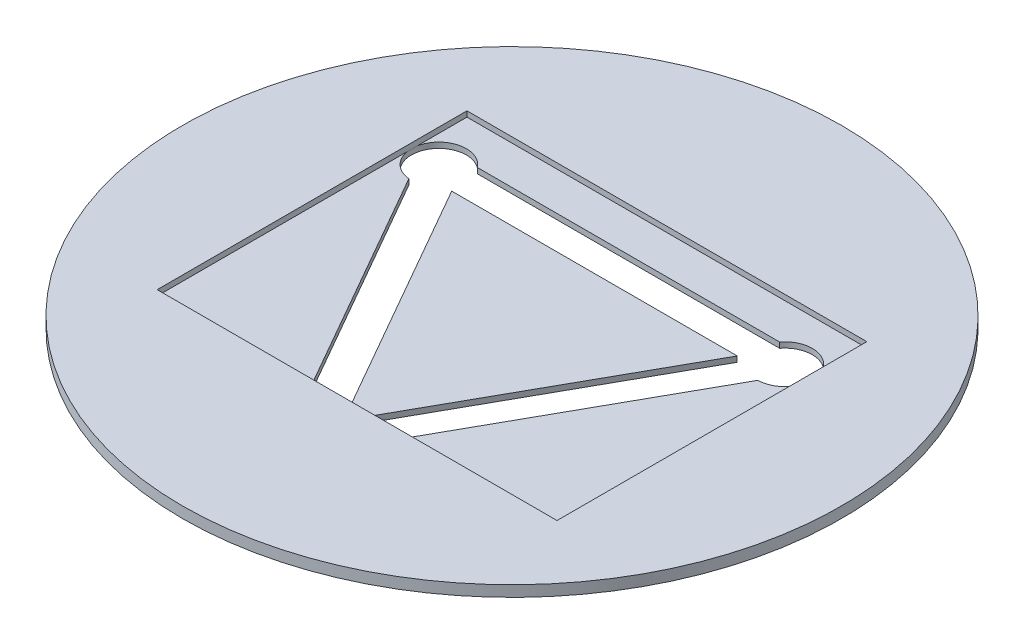
ISO-10303-21;
HEADER;
FILE_DESCRIPTION(('STEP AP214'),'2;1');
FILE_NAME('part.step','',(''),(''),'','','');
FILE_SCHEMA(('AUTOMOTIVE_DESIGN { 1 0 10303 214 1 1 1 1 }'));
ENDSEC;
DATA;
#1=APPLICATION_CONTEXT('core data for automotive mechanical design processes');
#2=APPLICATION_PROTOCOL_DEFINITION('international standard','automotive_design',2000,#1);
#3=PRODUCT_CONTEXT('',#1,'mechanical');
#4=PRODUCT('Part','Part','',(#3));
#5=PRODUCT_RELATED_PRODUCT_CATEGORY('part','',(#4));
#6=PRODUCT_DEFINITION_FORMATION('','',#4);
#7=PRODUCT_DEFINITION_CONTEXT('part definition',#1,'design');
#8=PRODUCT_DEFINITION('design','',#6,#7);
#9=PRODUCT_DEFINITION_SHAPE('','',#8);
#10=(LENGTH_UNIT() NAMED_UNIT(*) SI_UNIT(.MILLI.,.METRE.));
#11=(NAMED_UNIT(*) PLANE_ANGLE_UNIT() SI_UNIT($,.RADIAN.));
#12=(NAMED_UNIT(*) SI_UNIT($,.STERADIAN.) SOLID_ANGLE_UNIT());
#13=UNCERTAINTY_MEASURE_WITH_UNIT(LENGTH_MEASURE(1.E-05),#10,'distance_accuracy_value','');
#14=(GEOMETRIC_REPRESENTATION_CONTEXT(3) GLOBAL_UNCERTAINTY_ASSIGNED_CONTEXT((#13)) GLOBAL_UNIT_ASSIGNED_CONTEXT((#10,
#11,#12)) REPRESENTATION_CONTEXT('',''));
#15=CARTESIAN_POINT('',(0.,0.,0.));
#16=DIRECTION('',(0.,0.,1.));
#17=DIRECTION('',(1.,0.,0.));
#18=AXIS2_PLACEMENT_3D('',#15,#16,#17);
#19=CARTESIAN_POINT('',(0.,2.5,0.));
#20=DIRECTION('',(0.,-1.,0.));
#21=DIRECTION('',(0.,0.,-1.));
#22=AXIS2_PLACEMENT_3D('',#19,#20,#21);
#23=PLANE('',#22);
#24=CARTESIAN_POINT('',(78.7279655648643,2.5,-45.453612111618));
#25=DIRECTION('',(0.,-1.,0.));
#26=DIRECTION('',(0.,0.,-1.));
#27=AXIS2_PLACEMENT_3D('',#24,#25,#26);
#28=CIRCLE('',#27,12.5);
#29=CARTESIAN_POINT('',(91.,2.5,-43.0772344432236));
#30=VERTEX_POINT('',#29);
#31=CARTESIAN_POINT('',(78.934736547983,2.5,-32.9553223981996));
#32=VERTEX_POINT('',#31);
#33=EDGE_CURVE('E318',#30,#32,#28,.T.);
#34=ORIENTED_EDGE('',*,*,#33,.T.);
#35=DIRECTION('',(-0.48703970260465,0.,0.873379830364071));
#36=VECTOR('',#35,1.);
#37=CARTESIAN_POINT('',(78.934736547983,2.5,-32.9553223981996));
#38=LINE('',#37,#36);
#39=CARTESIAN_POINT('',(21.2429423229166,2.5,70.5));
#40=VERTEX_POINT('',#39);
#41=EDGE_CURVE('E218',#32,#40,#38,.T.);
#42=ORIENTED_EDGE('',*,*,#41,.T.);
#43=DIRECTION('',(1.,0.,0.));
#44=VECTOR('',#43,1.);
#45=CARTESIAN_POINT('',(-91.,2.5,70.5));
#46=LINE('',#45,#44);
#47=CARTESIAN_POINT('',(91.,2.5,70.5));
#48=VERTEX_POINT('',#47);
#49=EDGE_CURVE('E266',#40,#48,#46,.T.);
#50=ORIENTED_EDGE('',*,*,#49,.T.);
#51=DIRECTION('',(0.,0.,-1.));
#52=VECTOR('',#51,1.);
#53=CARTESIAN_POINT('',(91.,2.5,70.5));
#54=LINE('',#53,#52);
#55=EDGE_CURVE('E251',#48,#30,#54,.T.);
#56=ORIENTED_EDGE('',*,*,#55,.T.);
#57=EDGE_LOOP('',(#34,#42,#50,#56));
#58=FACE_BOUND('',#57,.T.);
#59=ADVANCED_FACE('F44',(#58),#23,.F.);
#60=CARTESIAN_POINT('',(-78.7279655648505,2.5,-45.453612111626));
#61=DIRECTION('',(0.,-1.,0.));
#62=DIRECTION('',(0.,0.,-1.));
#63=AXIS2_PLACEMENT_3D('',#60,#61,#62);
#64=CIRCLE('',#63,12.5);
#65=CARTESIAN_POINT('',(-91.,2.5,-47.8299897799495));
#66=VERTEX_POINT('',#65);
#67=CARTESIAN_POINT('',(-68.7826687848202,2.5,-53.0260008996584));
#68=VERTEX_POINT('',#67);
#69=EDGE_CURVE('E328',#66,#68,#64,.T.);
#70=ORIENTED_EDGE('',*,*,#69,.T.);
#71=DIRECTION('',(1.,0.,0.));
#72=VECTOR('',#71,1.);
#73=CARTESIAN_POINT('',(-68.7826687848202,2.5,-53.0260008996584));
#74=LINE('',#73,#72);
#75=CARTESIAN_POINT('',(68.7826687848401,2.5,-53.0260008996584));
#76=VERTEX_POINT('',#75);
#77=EDGE_CURVE('E212',#68,#76,#74,.T.);
#78=ORIENTED_EDGE('',*,*,#77,.T.);
#79=CARTESIAN_POINT('',(91.,2.5,-47.8299897800125));
#80=VERTEX_POINT('',#79);
#81=EDGE_CURVE('E319',#76,#80,#28,.T.);
#82=ORIENTED_EDGE('',*,*,#81,.T.);
#83=CARTESIAN_POINT('',(91.,2.5,-70.5));
#84=VERTEX_POINT('',#83);
#85=EDGE_CURVE('E257',#80,#84,#54,.T.);
#86=ORIENTED_EDGE('',*,*,#85,.T.);
#87=DIRECTION('',(-1.,0.,0.));
#88=VECTOR('',#87,1.);
#89=CARTESIAN_POINT('',(-91.,2.5,-70.5));
#90=LINE('',#89,#88);
#91=CARTESIAN_POINT('',(-91.,2.5,-70.5));
#92=VERTEX_POINT('',#91);
#93=EDGE_CURVE('E255',#84,#92,#90,.T.);
#94=ORIENTED_EDGE('',*,*,#93,.T.);
#95=DIRECTION('',(0.,0.,1.));
#96=VECTOR('',#95,1.);
#97=CARTESIAN_POINT('',(-91.,2.5,70.5));
#98=LINE('',#97,#96);
#99=EDGE_CURVE('E262',#92,#66,#98,.T.);
#100=ORIENTED_EDGE('',*,*,#99,.T.);
#101=EDGE_LOOP('',(#70,#78,#82,#86,#94,#100));
#102=FACE_BOUND('',#101,.T.);
#103=ADVANCED_FACE('F358',(#102),#23,.F.);
#104=DIRECTION('',(-0.496464150850641,0.,-0.868057225602179));
#105=VECTOR('',#104,1.);
#106=CARTESIAN_POINT('',(-32.8913255647166,2.5,18.8113911562814));
#107=LINE('',#106,#105);
#108=CARTESIAN_POINT('',(-3.3292868633556,2.5,70.5));
#109=VERTEX_POINT('',#108);
#110=CARTESIAN_POINT('',(-65.3152831992204,2.5,-37.8812233235856));
#111=VERTEX_POINT('',#110);
#112=EDGE_CURVE('E53',#109,#111,#107,.T.);
#113=ORIENTED_EDGE('',*,*,#112,.F.);
#114=CARTESIAN_POINT('',(4.20364127700811,2.5,70.5));
#115=VERTEX_POINT('',#114);
#116=EDGE_CURVE('E447',#109,#115,#46,.T.);
#117=ORIENTED_EDGE('',*,*,#116,.T.);
#118=DIRECTION('',(-0.48703970260465,0.,0.873379830364071));
#119=VECTOR('',#118,1.);
#120=CARTESIAN_POINT('',(0.484780027339367,2.5,77.1688165051294));
#121=LINE('',#120,#119);
#122=CARTESIAN_POINT('',(64.6423609958312,2.5,-37.8812233235856));
#123=VERTEX_POINT('',#122);
#124=EDGE_CURVE('E185',#123,#115,#121,.T.);
#125=ORIENTED_EDGE('',*,*,#124,.F.);
#126=DIRECTION('',(1.,0.,0.));
#127=VECTOR('',#126,1.);
#128=CARTESIAN_POINT('',(-65.3152831992204,2.5,-37.8812233235856));
#129=LINE('',#128,#127);
#130=EDGE_CURVE('E68',#111,#123,#129,.T.);
#131=ORIENTED_EDGE('',*,*,#130,.F.);
#132=EDGE_LOOP('',(#113,#117,#125,#131));
#133=FACE_BOUND('',#132,.T.);
#134=ADVANCED_FACE('F183',(#133),#23,.F.);
#135=CARTESIAN_POINT('',(-78.7279655648505,2.5,-45.453612111626));
#136=DIRECTION('',(0.,-1.,0.));
#137=DIRECTION('',(0.,0.,-1.));
#138=AXIS2_PLACEMENT_3D('',#135,#136,#137);
#139=PLANE('',#138);
#140=CARTESIAN_POINT('',(-91.,2.5,-43.0772344433026));
#141=VERTEX_POINT('',#140);
#142=EDGE_CURVE('E324',#141,#66,#64,.T.);
#143=ORIENTED_EDGE('',*,*,#142,.T.);
#144=EDGE_CURVE('E267',#66,#141,#98,.T.);
#145=ORIENTED_EDGE('',*,*,#144,.T.);
#146=EDGE_LOOP('',(#143,#145));
#147=FACE_BOUND('',#146,.T.);
#148=ADVANCED_FACE('F383',(#147),#139,.T.);
#149=CARTESIAN_POINT('',(78.7279655648643,2.5,-45.453612111618));
#150=DIRECTION('',(0.,-1.,0.));
#151=DIRECTION('',(0.,0.,-1.));
#152=AXIS2_PLACEMENT_3D('',#149,#150,#151);
#153=PLANE('',#152);
#154=EDGE_CURVE('E314',#80,#30,#28,.T.);
#155=ORIENTED_EDGE('',*,*,#154,.T.);
#156=EDGE_CURVE('E256',#30,#80,#54,.T.);
#157=ORIENTED_EDGE('',*,*,#156,.T.);
#158=EDGE_LOOP('',(#155,#157));
#159=FACE_BOUND('',#158,.T.);
#160=ADVANCED_FACE('F387',(#159),#153,.T.);
#161=CARTESIAN_POINT('',(0.,5.,0.));
#162=DIRECTION('',(0.,-1.,0.));
#163=DIRECTION('',(0.,0.,-1.));
#164=AXIS2_PLACEMENT_3D('',#161,#162,#163);
#165=CYLINDRICAL_SURFACE('',#164,150.);
#166=CARTESIAN_POINT('',(0.,5.,0.));
#167=DIRECTION('',(0.,1.,0.));
#168=DIRECTION('',(0.,0.,1.));
#169=AXIS2_PLACEMENT_3D('',#166,#167,#168);
#170=CIRCLE('',#169,150.);
#171=CARTESIAN_POINT('',(0.,5.,150.));
#172=VERTEX_POINT('',#171);
#173=EDGE_CURVE('E174',#172,#172,#170,.T.);
#174=ORIENTED_EDGE('',*,*,#173,.F.);
#175=EDGE_LOOP('',(#174));
#176=FACE_BOUND('',#175,.T.);
#177=CARTESIAN_POINT('',(0.,0.,0.));
#178=DIRECTION('',(0.,1.,0.));
#179=DIRECTION('',(0.,0.,1.));
#180=AXIS2_PLACEMENT_3D('',#177,#178,#179);
#181=CIRCLE('',#180,150.);
#182=CARTESIAN_POINT('',(0.,0.,150.));
#183=VERTEX_POINT('',#182);
#184=EDGE_CURVE('E305',#183,#183,#181,.T.);
#185=ORIENTED_EDGE('',*,*,#184,.T.);
#186=EDGE_LOOP('',(#185));
#187=FACE_BOUND('',#186,.T.);
#188=ADVANCED_FACE('F46',(#176,#187),#165,.T.);
#189=CARTESIAN_POINT('',(0.,5.,0.));
#190=DIRECTION('',(0.,1.,0.));
#191=DIRECTION('',(0.,0.,1.));
#192=AXIS2_PLACEMENT_3D('',#189,#190,#191);
#193=PLANE('',#192);
#194=DIRECTION('',(0.,0.,-1.));
#195=VECTOR('',#194,1.);
#196=CARTESIAN_POINT('',(91.,5.,70.5));
#197=LINE('',#196,#195);
#198=CARTESIAN_POINT('',(91.,5.,70.5));
#199=VERTEX_POINT('',#198);
#200=CARTESIAN_POINT('',(91.,5.,-70.5));
#201=VERTEX_POINT('',#200);
#202=EDGE_CURVE('E234',#199,#201,#197,.T.);
#203=ORIENTED_EDGE('',*,*,#202,.F.);
#204=DIRECTION('',(1.,0.,0.));
#205=VECTOR('',#204,1.);
#206=CARTESIAN_POINT('',(-91.,5.,70.5));
#207=LINE('',#206,#205);
#208=CARTESIAN_POINT('',(-91.,5.,70.5));
#209=VERTEX_POINT('',#208);
#210=EDGE_CURVE('E284',#209,#199,#207,.T.);
#211=ORIENTED_EDGE('',*,*,#210,.F.);
#212=DIRECTION('',(0.,0.,1.));
#213=VECTOR('',#212,1.);
#214=CARTESIAN_POINT('',(-91.,5.,70.5));
#215=LINE('',#214,#213);
#216=CARTESIAN_POINT('',(-91.,5.,-70.5));
#217=VERTEX_POINT('',#216);
#218=EDGE_CURVE('E280',#217,#209,#215,.T.);
#219=ORIENTED_EDGE('',*,*,#218,.F.);
#220=DIRECTION('',(-1.,0.,0.));
#221=VECTOR('',#220,1.);
#222=CARTESIAN_POINT('',(-91.,5.,-70.5));
#223=LINE('',#222,#221);
#224=EDGE_CURVE('E276',#201,#217,#223,.T.);
#225=ORIENTED_EDGE('',*,*,#224,.F.);
#226=EDGE_LOOP('',(#203,#211,#219,#225));
#227=FACE_BOUND('',#226,.T.);
#228=ORIENTED_EDGE('',*,*,#173,.T.);
#229=EDGE_LOOP('',(#228));
#230=FACE_BOUND('',#229,.T.);
#231=ADVANCED_FACE('F340',(#227,#230),#193,.T.);
#232=CARTESIAN_POINT('',(0.,0.,0.));
#233=DIRECTION('',(0.,1.,0.));
#234=DIRECTION('',(0.,0.,1.));
#235=AXIS2_PLACEMENT_3D('',#232,#233,#234);
#236=PLANE('',#235);
#237=CARTESIAN_POINT('',(0.,0.,90.907224223244));
#238=DIRECTION('',(0.,-1.,0.));
#239=DIRECTION('',(0.,0.,-1.));
#240=AXIS2_PLACEMENT_3D('',#237,#238,#239);
#241=CIRCLE('',#240,12.5);
#242=CARTESIAN_POINT('',(11.9349554493473,0.,87.1914687923665));
#243=VERTEX_POINT('',#242);
#244=CARTESIAN_POINT('',(-11.6593243931847,0.,86.4005453247105));
#245=VERTEX_POINT('',#244);
#246=EDGE_CURVE('E306',#243,#245,#241,.T.);
#247=ORIENTED_EDGE('',*,*,#246,.F.);
#248=DIRECTION('',(-0.48703970260465,0.,0.873379830364071));
#249=VECTOR('',#248,1.);
#250=CARTESIAN_POINT('',(78.934736547983,0.,-32.9553223981996));
#251=LINE('',#250,#249);
#252=CARTESIAN_POINT('',(78.934736547983,0.,-32.9553223981996));
#253=VERTEX_POINT('',#252);
#254=EDGE_CURVE('E213',#253,#243,#251,.T.);
#255=ORIENTED_EDGE('',*,*,#254,.F.);
#256=CARTESIAN_POINT('',(78.7279655648643,0.,-45.453612111618));
#257=DIRECTION('',(0.,-1.,0.));
#258=DIRECTION('',(0.,0.,-1.));
#259=AXIS2_PLACEMENT_3D('',#256,#257,#258);
#260=CIRCLE('',#259,12.5);
#261=CARTESIAN_POINT('',(68.7826687848401,0.,-53.0260008996584));
#262=VERTEX_POINT('',#261);
#263=EDGE_CURVE('E310',#262,#253,#260,.T.);
#264=ORIENTED_EDGE('',*,*,#263,.F.);
#265=DIRECTION('',(1.,0.,0.));
#266=VECTOR('',#265,1.);
#267=CARTESIAN_POINT('',(-68.7826687848202,0.,-53.0260008996584));
#268=LINE('',#267,#266);
#269=CARTESIAN_POINT('',(-68.7826687848202,0.,-53.0260008996584));
#270=VERTEX_POINT('',#269);
#271=EDGE_CURVE('E225',#270,#262,#268,.T.);
#272=ORIENTED_EDGE('',*,*,#271,.F.);
#273=CARTESIAN_POINT('',(-78.7279655648505,0.,-45.453612111626));
#274=DIRECTION('',(0.,-1.,0.));
#275=DIRECTION('',(0.,0.,-1.));
#276=AXIS2_PLACEMENT_3D('',#273,#274,#275);
#277=CIRCLE('',#276,12.5);
#278=CARTESIAN_POINT('',(-79.9555828961879,0.,-33.014039945036));
#279=VERTEX_POINT('',#278);
#280=EDGE_CURVE('E320',#279,#270,#277,.T.);
#281=ORIENTED_EDGE('',*,*,#280,.F.);
#282=DIRECTION('',(-0.496464150850641,0.,-0.868057225602179));
#283=VECTOR('',#282,1.);
#284=CARTESIAN_POINT('',(-11.6593243931847,0.,86.4005453247105));
#285=LINE('',#284,#283);
#286=EDGE_CURVE('E179',#245,#279,#285,.T.);
#287=ORIENTED_EDGE('',*,*,#286,.F.);
#288=EDGE_LOOP('',(#247,#255,#264,#272,#281,#287));
#289=FACE_BOUND('',#288,.T.);
#290=ORIENTED_EDGE('',*,*,#184,.F.);
#291=EDGE_LOOP('',(#290));
#292=FACE_BOUND('',#291,.T.);
#293=ADVANCED_FACE('F337',(#289,#292),#236,.F.);
#294=CARTESIAN_POINT('',(-78.7279655648505,2.5,-45.453612111626));
#295=DIRECTION('',(0.,-1.,0.));
#296=DIRECTION('',(0.,0.,-1.));
#297=AXIS2_PLACEMENT_3D('',#294,#295,#296);
#298=CYLINDRICAL_SURFACE('',#297,12.5);
#299=ORIENTED_EDGE('',*,*,#280,.T.);
#300=DIRECTION('',(0.,-1.,0.));
#301=VECTOR('',#300,1.);
#302=CARTESIAN_POINT('',(-68.7826687848202,2.5,-53.0260008996584));
#303=LINE('',#302,#301);
#304=EDGE_CURVE('E242',#68,#270,#303,.T.);
#305=ORIENTED_EDGE('',*,*,#304,.F.);
#306=ORIENTED_EDGE('',*,*,#69,.F.);
#307=ORIENTED_EDGE('',*,*,#142,.F.);
#308=CARTESIAN_POINT('',(-79.9555828961879,2.5,-33.014039945036));
#309=VERTEX_POINT('',#308);
#310=EDGE_CURVE('E291',#309,#141,#64,.T.);
#311=ORIENTED_EDGE('',*,*,#310,.F.);
#312=DIRECTION('',(0.,-1.,0.));
#313=VECTOR('',#312,1.);
#314=CARTESIAN_POINT('',(-79.9555828961879,2.5,-33.014039945036));
#315=LINE('',#314,#313);
#316=EDGE_CURVE('E245',#309,#279,#315,.T.);
#317=ORIENTED_EDGE('',*,*,#316,.T.);
#318=EDGE_LOOP('',(#299,#305,#306,#307,#311,#317));
#319=FACE_BOUND('',#318,.T.);
#320=ADVANCED_FACE('F339',(#319),#298,.F.);
#321=CARTESIAN_POINT('',(78.7279655648643,2.5,-45.453612111618));
#322=DIRECTION('',(0.,-1.,0.));
#323=DIRECTION('',(0.,0.,-1.));
#324=AXIS2_PLACEMENT_3D('',#321,#322,#323);
#325=CYLINDRICAL_SURFACE('',#324,12.5);
#326=ORIENTED_EDGE('',*,*,#263,.T.);
#327=DIRECTION('',(0.,-1.,0.));
#328=VECTOR('',#327,1.);
#329=CARTESIAN_POINT('',(78.934736547983,2.5,-32.9553223981996));
#330=LINE('',#329,#328);
#331=EDGE_CURVE('E235',#32,#253,#330,.T.);
#332=ORIENTED_EDGE('',*,*,#331,.F.);
#333=ORIENTED_EDGE('',*,*,#33,.F.);
#334=ORIENTED_EDGE('',*,*,#154,.F.);
#335=ORIENTED_EDGE('',*,*,#81,.F.);
#336=DIRECTION('',(0.,-1.,0.));
#337=VECTOR('',#336,1.);
#338=CARTESIAN_POINT('',(68.7826687848401,2.5,-53.0260008996584));
#339=LINE('',#338,#337);
#340=EDGE_CURVE('E238',#76,#262,#339,.T.);
#341=ORIENTED_EDGE('',*,*,#340,.T.);
#342=EDGE_LOOP('',(#326,#332,#333,#334,#335,#341));
#343=FACE_BOUND('',#342,.T.);
#344=ADVANCED_FACE('F347',(#343),#325,.F.);
#345=CARTESIAN_POINT('',(0.,2.5,90.907224223244));
#346=DIRECTION('',(0.,-1.,0.));
#347=DIRECTION('',(0.,0.,-1.));
#348=AXIS2_PLACEMENT_3D('',#345,#346,#347);
#349=CYLINDRICAL_SURFACE('',#348,12.5);
#350=CARTESIAN_POINT('',(0.,2.5,90.907224223244));
#351=DIRECTION('',(0.,-1.,0.));
#352=DIRECTION('',(0.,0.,-1.));
#353=AXIS2_PLACEMENT_3D('',#350,#351,#352);
#354=CIRCLE('',#353,12.5);
#355=CARTESIAN_POINT('',(11.9349554493473,2.5,87.1914687923665));
#356=VERTEX_POINT('',#355);
#357=CARTESIAN_POINT('',(-11.6593243931847,2.5,86.4005453247105));
#358=VERTEX_POINT('',#357);
#359=EDGE_CURVE('E301',#356,#358,#354,.T.);
#360=ORIENTED_EDGE('',*,*,#359,.F.);
#361=DIRECTION('',(0.,-1.,0.));
#362=VECTOR('',#361,1.);
#363=CARTESIAN_POINT('',(11.9349554493473,2.5,87.1914687923665));
#364=LINE('',#363,#362);
#365=EDGE_CURVE('E230',#356,#243,#364,.T.);
#366=ORIENTED_EDGE('',*,*,#365,.T.);
#367=ORIENTED_EDGE('',*,*,#246,.T.);
#368=DIRECTION('',(0.,-1.,0.));
#369=VECTOR('',#368,1.);
#370=CARTESIAN_POINT('',(-11.6593243931847,2.5,86.4005453247105));
#371=LINE('',#370,#369);
#372=EDGE_CURVE('E222',#358,#245,#371,.T.);
#373=ORIENTED_EDGE('',*,*,#372,.F.);
#374=EDGE_LOOP('',(#360,#366,#367,#373));
#375=FACE_BOUND('',#374,.T.);
#376=ADVANCED_FACE('F399',(#375),#349,.F.);
#377=CARTESIAN_POINT('',(0.,2.5,90.907224223244));
#378=DIRECTION('',(0.,-1.,0.));
#379=DIRECTION('',(0.,0.,-1.));
#380=AXIS2_PLACEMENT_3D('',#377,#378,#379);
#381=PLANE('',#380);
#382=ORIENTED_EDGE('',*,*,#359,.T.);
#383=DIRECTION('',(-0.496464150850641,0.,-0.868057225602179));
#384=VECTOR('',#383,1.);
#385=CARTESIAN_POINT('',(-11.6593243931847,2.5,86.4005453247105));
#386=LINE('',#385,#384);
#387=CARTESIAN_POINT('',(-20.7532533414961,2.5,70.5));
#388=VERTEX_POINT('',#387);
#389=EDGE_CURVE('E208',#358,#388,#386,.T.);
#390=ORIENTED_EDGE('',*,*,#389,.T.);
#391=EDGE_CURVE('E273',#388,#109,#46,.T.);
#392=ORIENTED_EDGE('',*,*,#391,.T.);
#393=DIRECTION('',(-0.496464150850641,0.,-0.868057225602179));
#394=VECTOR('',#393,1.);
#395=CARTESIAN_POINT('',(0.484780027339367,2.5,77.1688165051294));
#396=LINE('',#395,#394);
#397=CARTESIAN_POINT('',(0.484780027339368,2.5,77.1688165051294));
#398=VERTEX_POINT('',#397);
#399=EDGE_CURVE('E169',#398,#109,#396,.T.);
#400=ORIENTED_EDGE('',*,*,#399,.F.);
#401=EDGE_CURVE('E187',#115,#398,#121,.T.);
#402=ORIENTED_EDGE('',*,*,#401,.F.);
#403=EDGE_CURVE('E449',#115,#40,#46,.T.);
#404=ORIENTED_EDGE('',*,*,#403,.T.);
#405=EDGE_CURVE('E217',#40,#356,#38,.T.);
#406=ORIENTED_EDGE('',*,*,#405,.T.);
#407=EDGE_LOOP('',(#382,#390,#392,#400,#402,#404,#406));
#408=FACE_BOUND('',#407,.T.);
#409=ADVANCED_FACE('F403',(#408),#381,.T.);
#410=CARTESIAN_POINT('',(91.,2.5,70.5));
#411=DIRECTION('',(1.,0.,0.));
#412=DIRECTION('',(0.,0.,-1.));
#413=AXIS2_PLACEMENT_3D('',#410,#411,#412);
#414=PLANE('',#413);
#415=ORIENTED_EDGE('',*,*,#202,.T.);
#416=DIRECTION('',(0.,1.,0.));
#417=VECTOR('',#416,1.);
#418=CARTESIAN_POINT('',(91.,2.5,-70.5));
#419=LINE('',#418,#417);
#420=EDGE_CURVE('E272',#84,#201,#419,.T.);
#421=ORIENTED_EDGE('',*,*,#420,.F.);
#422=ORIENTED_EDGE('',*,*,#85,.F.);
#423=ORIENTED_EDGE('',*,*,#156,.F.);
#424=ORIENTED_EDGE('',*,*,#55,.F.);
#425=DIRECTION('',(0.,1.,0.));
#426=VECTOR('',#425,1.);
#427=CARTESIAN_POINT('',(91.,2.5,70.5));
#428=LINE('',#427,#426);
#429=EDGE_CURVE('E288',#48,#199,#428,.T.);
#430=ORIENTED_EDGE('',*,*,#429,.T.);
#431=EDGE_LOOP('',(#415,#421,#422,#423,#424,#430));
#432=FACE_BOUND('',#431,.T.);
#433=ADVANCED_FACE('F407',(#432),#414,.F.);
#434=CARTESIAN_POINT('',(-91.,2.5,70.5));
#435=DIRECTION('',(0.,0.,1.));
#436=DIRECTION('',(1.,0.,0.));
#437=AXIS2_PLACEMENT_3D('',#434,#435,#436);
#438=PLANE('',#437);
#439=ORIENTED_EDGE('',*,*,#210,.T.);
#440=ORIENTED_EDGE('',*,*,#429,.F.);
#441=ORIENTED_EDGE('',*,*,#49,.F.);
#442=ORIENTED_EDGE('',*,*,#403,.F.);
#443=ORIENTED_EDGE('',*,*,#116,.F.);
#444=ORIENTED_EDGE('',*,*,#391,.F.);
#445=CARTESIAN_POINT('',(-91.,2.5,70.5));
#446=VERTEX_POINT('',#445);
#447=EDGE_CURVE('E268',#446,#388,#46,.T.);
#448=ORIENTED_EDGE('',*,*,#447,.F.);
#449=DIRECTION('',(0.,1.,0.));
#450=VECTOR('',#449,1.);
#451=CARTESIAN_POINT('',(-91.,2.5,70.5));
#452=LINE('',#451,#450);
#453=EDGE_CURVE('E292',#446,#209,#452,.T.);
#454=ORIENTED_EDGE('',*,*,#453,.T.);
#455=EDGE_LOOP('',(#439,#440,#441,#442,#443,#444,#448,#454));
#456=FACE_BOUND('',#455,.T.);
#457=ADVANCED_FACE('F410',(#456),#438,.F.);
#458=CARTESIAN_POINT('',(-91.,2.5,70.5));
#459=DIRECTION('',(-1.,0.,0.));
#460=DIRECTION('',(0.,0.,1.));
#461=AXIS2_PLACEMENT_3D('',#458,#459,#460);
#462=PLANE('',#461);
#463=ORIENTED_EDGE('',*,*,#218,.T.);
#464=ORIENTED_EDGE('',*,*,#453,.F.);
#465=EDGE_CURVE('E261',#141,#446,#98,.T.);
#466=ORIENTED_EDGE('',*,*,#465,.F.);
#467=ORIENTED_EDGE('',*,*,#144,.F.);
#468=ORIENTED_EDGE('',*,*,#99,.F.);
#469=DIRECTION('',(0.,1.,0.));
#470=VECTOR('',#469,1.);
#471=CARTESIAN_POINT('',(-91.,2.5,-70.5));
#472=LINE('',#471,#470);
#473=EDGE_CURVE('E295',#92,#217,#472,.T.);
#474=ORIENTED_EDGE('',*,*,#473,.T.);
#475=EDGE_LOOP('',(#463,#464,#466,#467,#468,#474));
#476=FACE_BOUND('',#475,.T.);
#477=ADVANCED_FACE('F380',(#476),#462,.F.);
#478=CARTESIAN_POINT('',(-91.,2.5,-70.5));
#479=DIRECTION('',(0.,0.,-1.));
#480=DIRECTION('',(-1.,0.,0.));
#481=AXIS2_PLACEMENT_3D('',#478,#479,#480);
#482=PLANE('',#481);
#483=ORIENTED_EDGE('',*,*,#224,.T.);
#484=ORIENTED_EDGE('',*,*,#473,.F.);
#485=ORIENTED_EDGE('',*,*,#93,.F.);
#486=ORIENTED_EDGE('',*,*,#420,.T.);
#487=EDGE_LOOP('',(#483,#484,#485,#486));
#488=FACE_BOUND('',#487,.T.);
#489=ADVANCED_FACE('F372',(#488),#482,.F.);
#490=ORIENTED_EDGE('',*,*,#447,.T.);
#491=DIRECTION('',(-0.496464150850641,0.,-0.868057225602179));
#492=VECTOR('',#491,1.);
#493=CARTESIAN_POINT('',(-46.0206911019496,2.5,26.3204114378974));
#494=LINE('',#493,#492);
#495=EDGE_CURVE('E11',#388,#309,#494,.T.);
#496=ORIENTED_EDGE('',*,*,#495,.T.);
#497=ORIENTED_EDGE('',*,*,#310,.T.);
#498=ORIENTED_EDGE('',*,*,#465,.T.);
#499=EDGE_LOOP('',(#490,#496,#497,#498));
#500=FACE_BOUND('',#499,.T.);
#501=ADVANCED_FACE('F361',(#500),#23,.F.);
#502=CARTESIAN_POINT('',(0.484780027339367,2.5,77.1688165051294));
#503=DIRECTION('',(0.873379830364071,0.,0.48703970260465));
#504=DIRECTION('',(0.48703970260465,0.,-0.873379830364071));
#505=AXIS2_PLACEMENT_3D('',#502,#503,#504);
#506=PLANE('',#505);
#507=DIRECTION('',(-0.48703970260465,0.,0.873379830364071));
#508=VECTOR('',#507,1.);
#509=CARTESIAN_POINT('',(0.484780027339367,0.,77.1688165051294));
#510=LINE('',#509,#508);
#511=CARTESIAN_POINT('',(64.6423609958311,0.,-37.8812233235856));
#512=VERTEX_POINT('',#511);
#513=CARTESIAN_POINT('',(0.484780027339371,0.,77.1688165051294));
#514=VERTEX_POINT('',#513);
#515=EDGE_CURVE('E192',#512,#514,#510,.T.);
#516=ORIENTED_EDGE('',*,*,#515,.F.);
#517=DIRECTION('',(0.,-1.,0.));
#518=VECTOR('',#517,1.);
#519=CARTESIAN_POINT('',(64.6423609958312,2.5,-37.8812233235856));
#520=LINE('',#519,#518);
#521=EDGE_CURVE('E198',#123,#512,#520,.T.);
#522=ORIENTED_EDGE('',*,*,#521,.F.);
#523=ORIENTED_EDGE('',*,*,#124,.T.);
#524=ORIENTED_EDGE('',*,*,#401,.T.);
#525=DIRECTION('',(0.,-1.,0.));
#526=VECTOR('',#525,1.);
#527=CARTESIAN_POINT('',(0.484780027339367,2.5,77.1688165051294));
#528=LINE('',#527,#526);
#529=EDGE_CURVE('E180',#398,#514,#528,.T.);
#530=ORIENTED_EDGE('',*,*,#529,.T.);
#531=EDGE_LOOP('',(#516,#522,#523,#524,#530));
#532=FACE_BOUND('',#531,.T.);
#533=ADVANCED_FACE('F371',(#532),#506,.T.);
#534=CARTESIAN_POINT('',(0.484780027339367,2.5,77.1688165051294));
#535=DIRECTION('',(-0.868057225602179,0.,0.496464150850641));
#536=DIRECTION('',(0.496464150850641,0.,0.868057225602179));
#537=AXIS2_PLACEMENT_3D('',#534,#535,#536);
#538=PLANE('',#537);
#539=DIRECTION('',(-0.496464150850641,0.,-0.868057225602179));
#540=VECTOR('',#539,1.);
#541=CARTESIAN_POINT('',(0.484780027339367,0.,77.1688165051294));
#542=LINE('',#541,#540);
#543=CARTESIAN_POINT('',(-65.3152831992204,0.,-37.8812233235856));
#544=VERTEX_POINT('',#543);
#545=EDGE_CURVE('E60',#514,#544,#542,.T.);
#546=ORIENTED_EDGE('',*,*,#545,.F.);
#547=ORIENTED_EDGE('',*,*,#529,.F.);
#548=ORIENTED_EDGE('',*,*,#399,.T.);
#549=ORIENTED_EDGE('',*,*,#112,.T.);
#550=DIRECTION('',(0.,-1.,0.));
#551=VECTOR('',#550,1.);
#552=CARTESIAN_POINT('',(-65.3152831992204,2.5,-37.8812233235856));
#553=LINE('',#552,#551);
#554=EDGE_CURVE('E166',#111,#544,#553,.T.);
#555=ORIENTED_EDGE('',*,*,#554,.T.);
#556=EDGE_LOOP('',(#546,#547,#548,#549,#555));
#557=FACE_BOUND('',#556,.T.);
#558=ADVANCED_FACE('F165',(#557),#538,.T.);
#559=CARTESIAN_POINT('',(-65.3152831992204,2.5,-37.8812233235856));
#560=DIRECTION('',(0.,0.,-1.));
#561=DIRECTION('',(-1.,0.,0.));
#562=AXIS2_PLACEMENT_3D('',#559,#560,#561);
#563=PLANE('',#562);
#564=DIRECTION('',(1.,0.,0.));
#565=VECTOR('',#564,1.);
#566=CARTESIAN_POINT('',(-65.3152831992204,0.,-37.8812233235856));
#567=LINE('',#566,#565);
#568=EDGE_CURVE('E177',#544,#512,#567,.T.);
#569=ORIENTED_EDGE('',*,*,#568,.F.);
#570=ORIENTED_EDGE('',*,*,#554,.F.);
#571=ORIENTED_EDGE('',*,*,#130,.T.);
#572=ORIENTED_EDGE('',*,*,#521,.T.);
#573=EDGE_LOOP('',(#569,#570,#571,#572));
#574=FACE_BOUND('',#573,.T.);
#575=ADVANCED_FACE('F175',(#574),#563,.T.);
#576=CARTESIAN_POINT('',(78.934736547983,2.5,-32.9553223981996));
#577=DIRECTION('',(0.873379830364071,0.,0.48703970260465));
#578=DIRECTION('',(0.48703970260465,0.,-0.873379830364071));
#579=AXIS2_PLACEMENT_3D('',#576,#577,#578);
#580=PLANE('',#579);
#581=ORIENTED_EDGE('',*,*,#254,.T.);
#582=ORIENTED_EDGE('',*,*,#365,.F.);
#583=ORIENTED_EDGE('',*,*,#405,.F.);
#584=ORIENTED_EDGE('',*,*,#41,.F.);
#585=ORIENTED_EDGE('',*,*,#331,.T.);
#586=EDGE_LOOP('',(#581,#582,#583,#584,#585));
#587=FACE_BOUND('',#586,.T.);
#588=ADVANCED_FACE('F476',(#587),#580,.F.);
#589=CARTESIAN_POINT('',(-11.6593243931847,2.5,86.4005453247105));
#590=DIRECTION('',(-0.868057225602179,0.,0.496464150850641));
#591=DIRECTION('',(0.496464150850641,0.,0.868057225602179));
#592=AXIS2_PLACEMENT_3D('',#589,#590,#591);
#593=PLANE('',#592);
#594=ORIENTED_EDGE('',*,*,#286,.T.);
#595=ORIENTED_EDGE('',*,*,#316,.F.);
#596=ORIENTED_EDGE('',*,*,#495,.F.);
#597=ORIENTED_EDGE('',*,*,#389,.F.);
#598=ORIENTED_EDGE('',*,*,#372,.T.);
#599=EDGE_LOOP('',(#594,#595,#596,#597,#598));
#600=FACE_BOUND('',#599,.T.);
#601=ADVANCED_FACE('F461',(#600),#593,.F.);
#602=CARTESIAN_POINT('',(-68.7826687848202,2.5,-53.0260008996584));
#603=DIRECTION('',(0.,0.,-1.));
#604=DIRECTION('',(-1.,0.,0.));
#605=AXIS2_PLACEMENT_3D('',#602,#603,#604);
#606=PLANE('',#605);
#607=ORIENTED_EDGE('',*,*,#271,.T.);
#608=ORIENTED_EDGE('',*,*,#340,.F.);
#609=ORIENTED_EDGE('',*,*,#77,.F.);
#610=ORIENTED_EDGE('',*,*,#304,.T.);
#611=EDGE_LOOP('',(#607,#608,#609,#610));
#612=FACE_BOUND('',#611,.T.);
#613=ADVANCED_FACE('F355',(#612),#606,.F.);
#614=ORIENTED_EDGE('',*,*,#568,.T.);
#615=ORIENTED_EDGE('',*,*,#515,.T.);
#616=ORIENTED_EDGE('',*,*,#545,.T.);
#617=EDGE_LOOP('',(#614,#615,#616));
#618=FACE_BOUND('',#617,.T.);
#619=ADVANCED_FACE('F342',(#618),#236,.F.);
#620=CLOSED_SHELL('',(#59,#103,#134,#148,#160,#188,#231,#293,#320,#344,#376,#409,#433,#457,#477,
#489,#501,#533,#558,#575,#588,#601,#613,#619));
#621=MANIFOLD_SOLID_BREP('B2',#620);
#622=ADVANCED_BREP_SHAPE_REPRESENTATION('',(#18,#621),#14);
#623=SHAPE_DEFINITION_REPRESENTATION(#9,#622);
ENDSEC;
END-ISO-10303-21;
